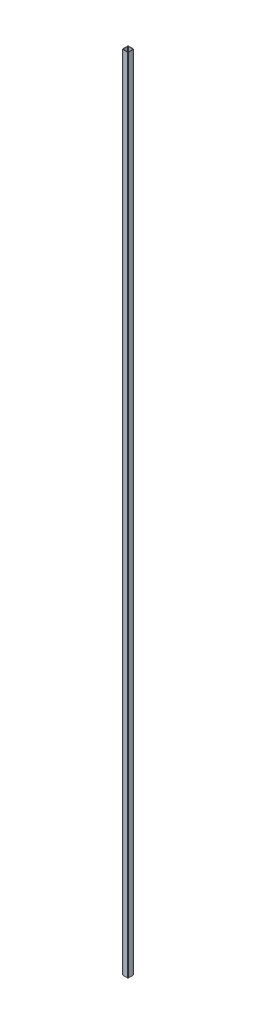
ISO-10303-21;
HEADER;
FILE_DESCRIPTION(('STEP AP214'),'2;1');
FILE_NAME('part.step','',(''),(''),'','','');
FILE_SCHEMA(('AUTOMOTIVE_DESIGN { 1 0 10303 214 1 1 1 1 }'));
ENDSEC;
DATA;
#1=APPLICATION_CONTEXT('core data for automotive mechanical design processes');
#2=APPLICATION_PROTOCOL_DEFINITION('international standard','automotive_design',2000,#1);
#3=PRODUCT_CONTEXT('',#1,'mechanical');
#4=PRODUCT('Part','Part','',(#3));
#5=PRODUCT_RELATED_PRODUCT_CATEGORY('part','',(#4));
#6=PRODUCT_DEFINITION_FORMATION('','',#4);
#7=PRODUCT_DEFINITION_CONTEXT('part definition',#1,'design');
#8=PRODUCT_DEFINITION('design','',#6,#7);
#9=PRODUCT_DEFINITION_SHAPE('','',#8);
#10=(LENGTH_UNIT() NAMED_UNIT(*) SI_UNIT(.MILLI.,.METRE.));
#11=(NAMED_UNIT(*) PLANE_ANGLE_UNIT() SI_UNIT($,.RADIAN.));
#12=(NAMED_UNIT(*) SI_UNIT($,.STERADIAN.) SOLID_ANGLE_UNIT());
#13=UNCERTAINTY_MEASURE_WITH_UNIT(LENGTH_MEASURE(1.E-05),#10,'distance_accuracy_value','');
#14=(GEOMETRIC_REPRESENTATION_CONTEXT(3) GLOBAL_UNCERTAINTY_ASSIGNED_CONTEXT((#13)) GLOBAL_UNIT_ASSIGNED_CONTEXT((#10,
#11,#12)) REPRESENTATION_CONTEXT('',''));
#15=CARTESIAN_POINT('',(0.,0.,0.));
#16=DIRECTION('',(0.,0.,1.));
#17=DIRECTION('',(1.,0.,0.));
#18=AXIS2_PLACEMENT_3D('',#15,#16,#17);
#19=CARTESIAN_POINT('',(-3.,1100.,-3.));
#20=DIRECTION('',(0.,-1.,0.));
#21=DIRECTION('',(0.,0.,1.));
#22=AXIS2_PLACEMENT_3D('',#19,#20,#21);
#23=PLANE('',#22);
#24=CARTESIAN_POINT('',(-3.,1100.,-3.));
#25=DIRECTION('',(0.,-1.,0.));
#26=DIRECTION('',(0.,0.,1.));
#27=AXIS2_PLACEMENT_3D('',#24,#25,#26);
#28=CIRCLE('',#27,1.);
#29=CARTESIAN_POINT('',(-4.,1100.,-3.));
#30=VERTEX_POINT('',#29);
#31=CARTESIAN_POINT('',(-3.,1100.,-4.));
#32=VERTEX_POINT('',#31);
#33=EDGE_CURVE('E215',#30,#32,#28,.T.);
#34=ORIENTED_EDGE('',*,*,#33,.F.);
#35=DIRECTION('',(0.,0.,-1.));
#36=VECTOR('',#35,1.);
#37=CARTESIAN_POINT('',(-4.,1100.,-3.));
#38=LINE('',#37,#36);
#39=CARTESIAN_POINT('',(-4.,1100.,3.));
#40=VERTEX_POINT('',#39);
#41=EDGE_CURVE('E237',#40,#30,#38,.T.);
#42=ORIENTED_EDGE('',*,*,#41,.F.);
#43=CARTESIAN_POINT('',(-3.,1100.,3.));
#44=DIRECTION('',(0.,-1.,0.));
#45=DIRECTION('',(0.,0.,1.));
#46=AXIS2_PLACEMENT_3D('',#43,#44,#45);
#47=CIRCLE('',#46,1.);
#48=CARTESIAN_POINT('',(-3.,1100.,4.));
#49=VERTEX_POINT('',#48);
#50=EDGE_CURVE('E234',#49,#40,#47,.T.);
#51=ORIENTED_EDGE('',*,*,#50,.F.);
#52=DIRECTION('',(-1.,0.,0.));
#53=VECTOR('',#52,1.);
#54=CARTESIAN_POINT('',(-3.,1100.,4.));
#55=LINE('',#54,#53);
#56=CARTESIAN_POINT('',(3.,1100.,4.));
#57=VERTEX_POINT('',#56);
#58=EDGE_CURVE('E231',#57,#49,#55,.T.);
#59=ORIENTED_EDGE('',*,*,#58,.F.);
#60=CARTESIAN_POINT('',(3.,1100.,3.));
#61=DIRECTION('',(0.,-1.,0.));
#62=DIRECTION('',(0.,0.,1.));
#63=AXIS2_PLACEMENT_3D('',#60,#61,#62);
#64=CIRCLE('',#63,1.);
#65=CARTESIAN_POINT('',(4.,1100.,3.));
#66=VERTEX_POINT('',#65);
#67=EDGE_CURVE('E228',#66,#57,#64,.T.);
#68=ORIENTED_EDGE('',*,*,#67,.F.);
#69=DIRECTION('',(0.,0.,1.));
#70=VECTOR('',#69,1.);
#71=CARTESIAN_POINT('',(4.,1100.,-3.));
#72=LINE('',#71,#70);
#73=CARTESIAN_POINT('',(4.,1100.,-3.));
#74=VERTEX_POINT('',#73);
#75=EDGE_CURVE('E225',#74,#66,#72,.T.);
#76=ORIENTED_EDGE('',*,*,#75,.F.);
#77=CARTESIAN_POINT('',(3.,1100.,-3.));
#78=DIRECTION('',(0.,-1.,0.));
#79=DIRECTION('',(0.,0.,-1.));
#80=AXIS2_PLACEMENT_3D('',#77,#78,#79);
#81=CIRCLE('',#80,1.);
#82=CARTESIAN_POINT('',(3.,1100.,-4.));
#83=VERTEX_POINT('',#82);
#84=EDGE_CURVE('E222',#83,#74,#81,.T.);
#85=ORIENTED_EDGE('',*,*,#84,.F.);
#86=DIRECTION('',(1.,0.,0.));
#87=VECTOR('',#86,1.);
#88=CARTESIAN_POINT('',(-3.,1100.,-4.));
#89=LINE('',#88,#87);
#90=EDGE_CURVE('E218',#32,#83,#89,.T.);
#91=ORIENTED_EDGE('',*,*,#90,.F.);
#92=EDGE_LOOP('',(#34,#42,#51,#59,#68,#76,#85,#91));
#93=FACE_BOUND('',#92,.T.);
#94=CARTESIAN_POINT('',(-2.5,1100.,-2.5));
#95=DIRECTION('',(0.,-1.,0.));
#96=DIRECTION('',(0.,0.,1.));
#97=AXIS2_PLACEMENT_3D('',#94,#95,#96);
#98=CIRCLE('',#97,1.);
#99=CARTESIAN_POINT('',(-3.5,1100.,-2.5));
#100=VERTEX_POINT('',#99);
#101=CARTESIAN_POINT('',(-2.5,1100.,-3.5));
#102=VERTEX_POINT('',#101);
#103=EDGE_CURVE('E150',#100,#102,#98,.T.);
#104=ORIENTED_EDGE('',*,*,#103,.T.);
#105=DIRECTION('',(1.,0.,0.));
#106=VECTOR('',#105,1.);
#107=CARTESIAN_POINT('',(-2.5,1100.,-3.5));
#108=LINE('',#107,#106);
#109=CARTESIAN_POINT('',(2.5,1100.,-3.5));
#110=VERTEX_POINT('',#109);
#111=EDGE_CURVE('E159',#102,#110,#108,.T.);
#112=ORIENTED_EDGE('',*,*,#111,.T.);
#113=CARTESIAN_POINT('',(2.5,1100.,-2.5));
#114=DIRECTION('',(0.,-1.,0.));
#115=DIRECTION('',(0.,0.,-1.));
#116=AXIS2_PLACEMENT_3D('',#113,#114,#115);
#117=CIRCLE('',#116,1.);
#118=CARTESIAN_POINT('',(3.5,1100.,-2.5));
#119=VERTEX_POINT('',#118);
#120=EDGE_CURVE('E164',#110,#119,#117,.T.);
#121=ORIENTED_EDGE('',*,*,#120,.T.);
#122=DIRECTION('',(0.,0.,1.));
#123=VECTOR('',#122,1.);
#124=CARTESIAN_POINT('',(3.5,1100.,-2.5));
#125=LINE('',#124,#123);
#126=CARTESIAN_POINT('',(3.5,1100.,2.5));
#127=VERTEX_POINT('',#126);
#128=EDGE_CURVE('E176',#119,#127,#125,.T.);
#129=ORIENTED_EDGE('',*,*,#128,.T.);
#130=CARTESIAN_POINT('',(2.5,1100.,2.5));
#131=DIRECTION('',(0.,-1.,0.));
#132=DIRECTION('',(0.,0.,1.));
#133=AXIS2_PLACEMENT_3D('',#130,#131,#132);
#134=CIRCLE('',#133,1.);
#135=CARTESIAN_POINT('',(2.5,1100.,3.5));
#136=VERTEX_POINT('',#135);
#137=EDGE_CURVE('E179',#127,#136,#134,.T.);
#138=ORIENTED_EDGE('',*,*,#137,.T.);
#139=DIRECTION('',(-1.,0.,0.));
#140=VECTOR('',#139,1.);
#141=CARTESIAN_POINT('',(-2.5,1100.,3.5));
#142=LINE('',#141,#140);
#143=CARTESIAN_POINT('',(-2.5,1100.,3.5));
#144=VERTEX_POINT('',#143);
#145=EDGE_CURVE('E182',#136,#144,#142,.T.);
#146=ORIENTED_EDGE('',*,*,#145,.T.);
#147=CARTESIAN_POINT('',(-2.5,1100.,2.5));
#148=DIRECTION('',(0.,-1.,0.));
#149=DIRECTION('',(0.,0.,1.));
#150=AXIS2_PLACEMENT_3D('',#147,#148,#149);
#151=CIRCLE('',#150,1.);
#152=CARTESIAN_POINT('',(-3.5,1100.,2.5));
#153=VERTEX_POINT('',#152);
#154=EDGE_CURVE('E185',#144,#153,#151,.T.);
#155=ORIENTED_EDGE('',*,*,#154,.T.);
#156=DIRECTION('',(0.,0.,-1.));
#157=VECTOR('',#156,1.);
#158=CARTESIAN_POINT('',(-3.5,1100.,-2.5));
#159=LINE('',#158,#157);
#160=EDGE_CURVE('E168',#153,#100,#159,.T.);
#161=ORIENTED_EDGE('',*,*,#160,.T.);
#162=EDGE_LOOP('',(#104,#112,#121,#129,#138,#146,#155,#161));
#163=FACE_BOUND('',#162,.T.);
#164=ADVANCED_FACE('F35',(#93,#163),#23,.F.);
#165=CARTESIAN_POINT('',(-3.,0.,-3.));
#166=DIRECTION('',(0.,-1.,0.));
#167=DIRECTION('',(0.,0.,1.));
#168=AXIS2_PLACEMENT_3D('',#165,#166,#167);
#169=PLANE('',#168);
#170=CARTESIAN_POINT('',(-3.,0.,-3.));
#171=DIRECTION('',(0.,-1.,0.));
#172=DIRECTION('',(0.,0.,1.));
#173=AXIS2_PLACEMENT_3D('',#170,#171,#172);
#174=CIRCLE('',#173,1.);
#175=CARTESIAN_POINT('',(-4.,0.,-3.));
#176=VERTEX_POINT('',#175);
#177=CARTESIAN_POINT('',(-3.,0.,-4.));
#178=VERTEX_POINT('',#177);
#179=EDGE_CURVE('E155',#176,#178,#174,.T.);
#180=ORIENTED_EDGE('',*,*,#179,.T.);
#181=DIRECTION('',(1.,0.,0.));
#182=VECTOR('',#181,1.);
#183=CARTESIAN_POINT('',(-3.,0.,-4.));
#184=LINE('',#183,#182);
#185=CARTESIAN_POINT('',(3.,0.,-4.));
#186=VERTEX_POINT('',#185);
#187=EDGE_CURVE('E243',#178,#186,#184,.T.);
#188=ORIENTED_EDGE('',*,*,#187,.T.);
#189=CARTESIAN_POINT('',(3.,0.,-3.));
#190=DIRECTION('',(0.,-1.,0.));
#191=DIRECTION('',(0.,0.,-1.));
#192=AXIS2_PLACEMENT_3D('',#189,#190,#191);
#193=CIRCLE('',#192,1.);
#194=CARTESIAN_POINT('',(4.,0.,-3.));
#195=VERTEX_POINT('',#194);
#196=EDGE_CURVE('E246',#186,#195,#193,.T.);
#197=ORIENTED_EDGE('',*,*,#196,.T.);
#198=DIRECTION('',(0.,0.,1.));
#199=VECTOR('',#198,1.);
#200=CARTESIAN_POINT('',(4.,0.,-3.));
#201=LINE('',#200,#199);
#202=CARTESIAN_POINT('',(4.,0.,3.));
#203=VERTEX_POINT('',#202);
#204=EDGE_CURVE('E249',#195,#203,#201,.T.);
#205=ORIENTED_EDGE('',*,*,#204,.T.);
#206=CARTESIAN_POINT('',(3.,0.,3.));
#207=DIRECTION('',(0.,-1.,0.));
#208=DIRECTION('',(0.,0.,1.));
#209=AXIS2_PLACEMENT_3D('',#206,#207,#208);
#210=CIRCLE('',#209,1.);
#211=CARTESIAN_POINT('',(3.,0.,4.));
#212=VERTEX_POINT('',#211);
#213=EDGE_CURVE('E252',#203,#212,#210,.T.);
#214=ORIENTED_EDGE('',*,*,#213,.T.);
#215=DIRECTION('',(-1.,0.,0.));
#216=VECTOR('',#215,1.);
#217=CARTESIAN_POINT('',(-3.,0.,4.));
#218=LINE('',#217,#216);
#219=CARTESIAN_POINT('',(-3.,0.,4.));
#220=VERTEX_POINT('',#219);
#221=EDGE_CURVE('E255',#212,#220,#218,.T.);
#222=ORIENTED_EDGE('',*,*,#221,.T.);
#223=CARTESIAN_POINT('',(-3.,0.,3.));
#224=DIRECTION('',(0.,-1.,0.));
#225=DIRECTION('',(0.,0.,1.));
#226=AXIS2_PLACEMENT_3D('',#223,#224,#225);
#227=CIRCLE('',#226,1.);
#228=CARTESIAN_POINT('',(-4.,0.,3.));
#229=VERTEX_POINT('',#228);
#230=EDGE_CURVE('E258',#220,#229,#227,.T.);
#231=ORIENTED_EDGE('',*,*,#230,.T.);
#232=DIRECTION('',(0.,0.,-1.));
#233=VECTOR('',#232,1.);
#234=CARTESIAN_POINT('',(-4.,0.,-3.));
#235=LINE('',#234,#233);
#236=EDGE_CURVE('E219',#229,#176,#235,.T.);
#237=ORIENTED_EDGE('',*,*,#236,.T.);
#238=EDGE_LOOP('',(#180,#188,#197,#205,#214,#222,#231,#237));
#239=FACE_BOUND('',#238,.T.);
#240=DIRECTION('',(0.,0.,-1.));
#241=VECTOR('',#240,1.);
#242=CARTESIAN_POINT('',(-3.5,0.,-2.5));
#243=LINE('',#242,#241);
#244=CARTESIAN_POINT('',(-3.5,0.,2.5));
#245=VERTEX_POINT('',#244);
#246=CARTESIAN_POINT('',(-3.5,0.,-2.5));
#247=VERTEX_POINT('',#246);
#248=EDGE_CURVE('E169',#245,#247,#243,.T.);
#249=ORIENTED_EDGE('',*,*,#248,.F.);
#250=CARTESIAN_POINT('',(-2.5,0.,2.5));
#251=DIRECTION('',(0.,-1.,0.));
#252=DIRECTION('',(0.,0.,1.));
#253=AXIS2_PLACEMENT_3D('',#250,#251,#252);
#254=CIRCLE('',#253,1.);
#255=CARTESIAN_POINT('',(-2.5,0.,3.5));
#256=VERTEX_POINT('',#255);
#257=EDGE_CURVE('E172',#256,#245,#254,.T.);
#258=ORIENTED_EDGE('',*,*,#257,.F.);
#259=DIRECTION('',(-1.,0.,0.));
#260=VECTOR('',#259,1.);
#261=CARTESIAN_POINT('',(-2.5,0.,3.5));
#262=LINE('',#261,#260);
#263=CARTESIAN_POINT('',(2.5,0.,3.5));
#264=VERTEX_POINT('',#263);
#265=EDGE_CURVE('E200',#264,#256,#262,.T.);
#266=ORIENTED_EDGE('',*,*,#265,.F.);
#267=CARTESIAN_POINT('',(2.5,0.,2.5));
#268=DIRECTION('',(0.,-1.,0.));
#269=DIRECTION('',(0.,0.,1.));
#270=AXIS2_PLACEMENT_3D('',#267,#268,#269);
#271=CIRCLE('',#270,1.);
#272=CARTESIAN_POINT('',(3.5,0.,2.5));
#273=VERTEX_POINT('',#272);
#274=EDGE_CURVE('E197',#273,#264,#271,.T.);
#275=ORIENTED_EDGE('',*,*,#274,.F.);
#276=DIRECTION('',(0.,0.,1.));
#277=VECTOR('',#276,1.);
#278=CARTESIAN_POINT('',(3.5,0.,-2.5));
#279=LINE('',#278,#277);
#280=CARTESIAN_POINT('',(3.5,0.,-2.5));
#281=VERTEX_POINT('',#280);
#282=EDGE_CURVE('E194',#281,#273,#279,.T.);
#283=ORIENTED_EDGE('',*,*,#282,.F.);
#284=CARTESIAN_POINT('',(2.5,0.,-2.5));
#285=DIRECTION('',(0.,-1.,0.));
#286=DIRECTION('',(0.,0.,-1.));
#287=AXIS2_PLACEMENT_3D('',#284,#285,#286);
#288=CIRCLE('',#287,1.);
#289=CARTESIAN_POINT('',(2.5,0.,-3.5));
#290=VERTEX_POINT('',#289);
#291=EDGE_CURVE('E191',#290,#281,#288,.T.);
#292=ORIENTED_EDGE('',*,*,#291,.F.);
#293=DIRECTION('',(1.,0.,0.));
#294=VECTOR('',#293,1.);
#295=CARTESIAN_POINT('',(-2.5,0.,-3.5));
#296=LINE('',#295,#294);
#297=CARTESIAN_POINT('',(-2.5,0.,-3.5));
#298=VERTEX_POINT('',#297);
#299=EDGE_CURVE('E189',#298,#290,#296,.T.);
#300=ORIENTED_EDGE('',*,*,#299,.F.);
#301=CARTESIAN_POINT('',(-2.5,0.,-2.5));
#302=DIRECTION('',(0.,-1.,0.));
#303=DIRECTION('',(0.,0.,1.));
#304=AXIS2_PLACEMENT_3D('',#301,#302,#303);
#305=CIRCLE('',#304,1.);
#306=EDGE_CURVE('E151',#247,#298,#305,.T.);
#307=ORIENTED_EDGE('',*,*,#306,.F.);
#308=EDGE_LOOP('',(#249,#258,#266,#275,#283,#292,#300,#307));
#309=FACE_BOUND('',#308,.T.);
#310=ADVANCED_FACE('F283',(#239,#309),#169,.T.);
#311=CARTESIAN_POINT('',(-3.,1100.,-3.));
#312=DIRECTION('',(0.,-1.,0.));
#313=DIRECTION('',(0.,0.,1.));
#314=AXIS2_PLACEMENT_3D('',#311,#312,#313);
#315=CYLINDRICAL_SURFACE('',#314,1.);
#316=ORIENTED_EDGE('',*,*,#179,.F.);
#317=DIRECTION('',(0.,-1.,0.));
#318=VECTOR('',#317,1.);
#319=CARTESIAN_POINT('',(-4.,1100.,-3.));
#320=LINE('',#319,#318);
#321=EDGE_CURVE('E240',#30,#176,#320,.T.);
#322=ORIENTED_EDGE('',*,*,#321,.F.);
#323=ORIENTED_EDGE('',*,*,#33,.T.);
#324=DIRECTION('',(0.,-1.,0.));
#325=VECTOR('',#324,1.);
#326=CARTESIAN_POINT('',(-3.,1100.,-4.));
#327=LINE('',#326,#325);
#328=EDGE_CURVE('E11',#32,#178,#327,.T.);
#329=ORIENTED_EDGE('',*,*,#328,.T.);
#330=EDGE_LOOP('',(#316,#322,#323,#329));
#331=FACE_BOUND('',#330,.T.);
#332=ADVANCED_FACE('F37',(#331),#315,.T.);
#333=CARTESIAN_POINT('',(-3.,1100.,-4.));
#334=DIRECTION('',(0.,0.,1.));
#335=DIRECTION('',(-1.,0.,0.));
#336=AXIS2_PLACEMENT_3D('',#333,#334,#335);
#337=PLANE('',#336);
#338=ORIENTED_EDGE('',*,*,#187,.F.);
#339=ORIENTED_EDGE('',*,*,#328,.F.);
#340=ORIENTED_EDGE('',*,*,#90,.T.);
#341=DIRECTION('',(0.,-1.,0.));
#342=VECTOR('',#341,1.);
#343=CARTESIAN_POINT('',(3.,1100.,-4.));
#344=LINE('',#343,#342);
#345=EDGE_CURVE('E43',#83,#186,#344,.T.);
#346=ORIENTED_EDGE('',*,*,#345,.T.);
#347=EDGE_LOOP('',(#338,#339,#340,#346));
#348=FACE_BOUND('',#347,.T.);
#349=ADVANCED_FACE('F276',(#348),#337,.F.);
#350=CARTESIAN_POINT('',(3.,1100.,-3.));
#351=DIRECTION('',(0.,-1.,0.));
#352=DIRECTION('',(0.,0.,1.));
#353=AXIS2_PLACEMENT_3D('',#350,#351,#352);
#354=CYLINDRICAL_SURFACE('',#353,1.);
#355=ORIENTED_EDGE('',*,*,#196,.F.);
#356=ORIENTED_EDGE('',*,*,#345,.F.);
#357=ORIENTED_EDGE('',*,*,#84,.T.);
#358=DIRECTION('',(0.,-1.,0.));
#359=VECTOR('',#358,1.);
#360=CARTESIAN_POINT('',(4.,1100.,-3.));
#361=LINE('',#360,#359);
#362=EDGE_CURVE('E272',#74,#195,#361,.T.);
#363=ORIENTED_EDGE('',*,*,#362,.T.);
#364=EDGE_LOOP('',(#355,#356,#357,#363));
#365=FACE_BOUND('',#364,.T.);
#366=ADVANCED_FACE('F280',(#365),#354,.T.);
#367=CARTESIAN_POINT('',(4.,1100.,-3.));
#368=DIRECTION('',(-1.,0.,0.));
#369=DIRECTION('',(0.,0.,-1.));
#370=AXIS2_PLACEMENT_3D('',#367,#368,#369);
#371=PLANE('',#370);
#372=ORIENTED_EDGE('',*,*,#204,.F.);
#373=ORIENTED_EDGE('',*,*,#362,.F.);
#374=ORIENTED_EDGE('',*,*,#75,.T.);
#375=DIRECTION('',(0.,-1.,0.));
#376=VECTOR('',#375,1.);
#377=CARTESIAN_POINT('',(4.,1100.,3.));
#378=LINE('',#377,#376);
#379=EDGE_CURVE('E270',#66,#203,#378,.T.);
#380=ORIENTED_EDGE('',*,*,#379,.T.);
#381=EDGE_LOOP('',(#372,#373,#374,#380));
#382=FACE_BOUND('',#381,.T.);
#383=ADVANCED_FACE('F295',(#382),#371,.F.);
#384=CARTESIAN_POINT('',(3.,1100.,3.));
#385=DIRECTION('',(0.,-1.,0.));
#386=DIRECTION('',(0.,0.,1.));
#387=AXIS2_PLACEMENT_3D('',#384,#385,#386);
#388=CYLINDRICAL_SURFACE('',#387,1.);
#389=ORIENTED_EDGE('',*,*,#213,.F.);
#390=ORIENTED_EDGE('',*,*,#379,.F.);
#391=ORIENTED_EDGE('',*,*,#67,.T.);
#392=DIRECTION('',(0.,-1.,0.));
#393=VECTOR('',#392,1.);
#394=CARTESIAN_POINT('',(3.,1100.,4.));
#395=LINE('',#394,#393);
#396=EDGE_CURVE('E268',#57,#212,#395,.T.);
#397=ORIENTED_EDGE('',*,*,#396,.T.);
#398=EDGE_LOOP('',(#389,#390,#391,#397));
#399=FACE_BOUND('',#398,.T.);
#400=ADVANCED_FACE('F299',(#399),#388,.T.);
#401=CARTESIAN_POINT('',(-3.,1100.,4.));
#402=DIRECTION('',(0.,0.,-1.));
#403=DIRECTION('',(1.,0.,0.));
#404=AXIS2_PLACEMENT_3D('',#401,#402,#403);
#405=PLANE('',#404);
#406=ORIENTED_EDGE('',*,*,#221,.F.);
#407=ORIENTED_EDGE('',*,*,#396,.F.);
#408=ORIENTED_EDGE('',*,*,#58,.T.);
#409=DIRECTION('',(0.,-1.,0.));
#410=VECTOR('',#409,1.);
#411=CARTESIAN_POINT('',(-3.,1100.,4.));
#412=LINE('',#411,#410);
#413=EDGE_CURVE('E266',#49,#220,#412,.T.);
#414=ORIENTED_EDGE('',*,*,#413,.T.);
#415=EDGE_LOOP('',(#406,#407,#408,#414));
#416=FACE_BOUND('',#415,.T.);
#417=ADVANCED_FACE('F301',(#416),#405,.F.);
#418=CARTESIAN_POINT('',(-3.,1100.,3.));
#419=DIRECTION('',(0.,-1.,0.));
#420=DIRECTION('',(0.,0.,1.));
#421=AXIS2_PLACEMENT_3D('',#418,#419,#420);
#422=CYLINDRICAL_SURFACE('',#421,1.);
#423=ORIENTED_EDGE('',*,*,#230,.F.);
#424=ORIENTED_EDGE('',*,*,#413,.F.);
#425=ORIENTED_EDGE('',*,*,#50,.T.);
#426=DIRECTION('',(0.,-1.,0.));
#427=VECTOR('',#426,1.);
#428=CARTESIAN_POINT('',(-4.,1100.,3.));
#429=LINE('',#428,#427);
#430=EDGE_CURVE('E264',#40,#229,#429,.T.);
#431=ORIENTED_EDGE('',*,*,#430,.T.);
#432=EDGE_LOOP('',(#423,#424,#425,#431));
#433=FACE_BOUND('',#432,.T.);
#434=ADVANCED_FACE('F305',(#433),#422,.T.);
#435=CARTESIAN_POINT('',(-4.,1100.,-3.));
#436=DIRECTION('',(1.,0.,0.));
#437=DIRECTION('',(0.,0.,1.));
#438=AXIS2_PLACEMENT_3D('',#435,#436,#437);
#439=PLANE('',#438);
#440=ORIENTED_EDGE('',*,*,#236,.F.);
#441=ORIENTED_EDGE('',*,*,#430,.F.);
#442=ORIENTED_EDGE('',*,*,#41,.T.);
#443=ORIENTED_EDGE('',*,*,#321,.T.);
#444=EDGE_LOOP('',(#440,#441,#442,#443));
#445=FACE_BOUND('',#444,.T.);
#446=ADVANCED_FACE('F307',(#445),#439,.F.);
#447=CARTESIAN_POINT('',(-2.5,1100.,-2.5));
#448=DIRECTION('',(0.,-1.,0.));
#449=DIRECTION('',(0.,0.,1.));
#450=AXIS2_PLACEMENT_3D('',#447,#448,#449);
#451=CYLINDRICAL_SURFACE('',#450,1.);
#452=ORIENTED_EDGE('',*,*,#306,.T.);
#453=DIRECTION('',(0.,-1.,0.));
#454=VECTOR('',#453,1.);
#455=CARTESIAN_POINT('',(-2.5,1100.,-3.5));
#456=LINE('',#455,#454);
#457=EDGE_CURVE('E146',#102,#298,#456,.T.);
#458=ORIENTED_EDGE('',*,*,#457,.F.);
#459=ORIENTED_EDGE('',*,*,#103,.F.);
#460=DIRECTION('',(0.,-1.,0.));
#461=VECTOR('',#460,1.);
#462=CARTESIAN_POINT('',(-3.5,1100.,-2.5));
#463=LINE('',#462,#461);
#464=EDGE_CURVE('E58',#100,#247,#463,.T.);
#465=ORIENTED_EDGE('',*,*,#464,.T.);
#466=EDGE_LOOP('',(#452,#458,#459,#465));
#467=FACE_BOUND('',#466,.T.);
#468=ADVANCED_FACE('F148',(#467),#451,.F.);
#469=CARTESIAN_POINT('',(-2.5,1100.,-3.5));
#470=DIRECTION('',(0.,0.,1.));
#471=DIRECTION('',(-1.,0.,0.));
#472=AXIS2_PLACEMENT_3D('',#469,#470,#471);
#473=PLANE('',#472);
#474=ORIENTED_EDGE('',*,*,#299,.T.);
#475=DIRECTION('',(0.,-1.,0.));
#476=VECTOR('',#475,1.);
#477=CARTESIAN_POINT('',(2.5,1100.,-3.5));
#478=LINE('',#477,#476);
#479=EDGE_CURVE('E156',#110,#290,#478,.T.);
#480=ORIENTED_EDGE('',*,*,#479,.F.);
#481=ORIENTED_EDGE('',*,*,#111,.F.);
#482=ORIENTED_EDGE('',*,*,#457,.T.);
#483=EDGE_LOOP('',(#474,#480,#481,#482));
#484=FACE_BOUND('',#483,.T.);
#485=ADVANCED_FACE('F160',(#484),#473,.T.);
#486=CARTESIAN_POINT('',(2.5,1100.,-2.5));
#487=DIRECTION('',(0.,-1.,0.));
#488=DIRECTION('',(0.,0.,1.));
#489=AXIS2_PLACEMENT_3D('',#486,#487,#488);
#490=CYLINDRICAL_SURFACE('',#489,1.);
#491=ORIENTED_EDGE('',*,*,#291,.T.);
#492=DIRECTION('',(0.,-1.,0.));
#493=VECTOR('',#492,1.);
#494=CARTESIAN_POINT('',(3.5,1100.,-2.5));
#495=LINE('',#494,#493);
#496=EDGE_CURVE('E212',#119,#281,#495,.T.);
#497=ORIENTED_EDGE('',*,*,#496,.F.);
#498=ORIENTED_EDGE('',*,*,#120,.F.);
#499=ORIENTED_EDGE('',*,*,#479,.T.);
#500=EDGE_LOOP('',(#491,#497,#498,#499));
#501=FACE_BOUND('',#500,.T.);
#502=ADVANCED_FACE('F325',(#501),#490,.F.);
#503=CARTESIAN_POINT('',(3.5,1100.,-2.5));
#504=DIRECTION('',(-1.,0.,0.));
#505=DIRECTION('',(0.,0.,-1.));
#506=AXIS2_PLACEMENT_3D('',#503,#504,#505);
#507=PLANE('',#506);
#508=ORIENTED_EDGE('',*,*,#282,.T.);
#509=DIRECTION('',(0.,-1.,0.));
#510=VECTOR('',#509,1.);
#511=CARTESIAN_POINT('',(3.5,1100.,2.5));
#512=LINE('',#511,#510);
#513=EDGE_CURVE('E210',#127,#273,#512,.T.);
#514=ORIENTED_EDGE('',*,*,#513,.F.);
#515=ORIENTED_EDGE('',*,*,#128,.F.);
#516=ORIENTED_EDGE('',*,*,#496,.T.);
#517=EDGE_LOOP('',(#508,#514,#515,#516));
#518=FACE_BOUND('',#517,.T.);
#519=ADVANCED_FACE('F328',(#518),#507,.T.);
#520=CARTESIAN_POINT('',(2.5,1100.,2.5));
#521=DIRECTION('',(0.,-1.,0.));
#522=DIRECTION('',(0.,0.,1.));
#523=AXIS2_PLACEMENT_3D('',#520,#521,#522);
#524=CYLINDRICAL_SURFACE('',#523,1.);
#525=ORIENTED_EDGE('',*,*,#274,.T.);
#526=DIRECTION('',(0.,-1.,0.));
#527=VECTOR('',#526,1.);
#528=CARTESIAN_POINT('',(2.5,1100.,3.5));
#529=LINE('',#528,#527);
#530=EDGE_CURVE('E208',#136,#264,#529,.T.);
#531=ORIENTED_EDGE('',*,*,#530,.F.);
#532=ORIENTED_EDGE('',*,*,#137,.F.);
#533=ORIENTED_EDGE('',*,*,#513,.T.);
#534=EDGE_LOOP('',(#525,#531,#532,#533));
#535=FACE_BOUND('',#534,.T.);
#536=ADVANCED_FACE('F332',(#535),#524,.F.);
#537=CARTESIAN_POINT('',(-2.5,1100.,3.5));
#538=DIRECTION('',(0.,0.,-1.));
#539=DIRECTION('',(1.,0.,0.));
#540=AXIS2_PLACEMENT_3D('',#537,#538,#539);
#541=PLANE('',#540);
#542=ORIENTED_EDGE('',*,*,#265,.T.);
#543=DIRECTION('',(0.,-1.,0.));
#544=VECTOR('',#543,1.);
#545=CARTESIAN_POINT('',(-2.5,1100.,3.5));
#546=LINE('',#545,#544);
#547=EDGE_CURVE('E206',#144,#256,#546,.T.);
#548=ORIENTED_EDGE('',*,*,#547,.F.);
#549=ORIENTED_EDGE('',*,*,#145,.F.);
#550=ORIENTED_EDGE('',*,*,#530,.T.);
#551=EDGE_LOOP('',(#542,#548,#549,#550));
#552=FACE_BOUND('',#551,.T.);
#553=ADVANCED_FACE('F336',(#552),#541,.T.);
#554=CARTESIAN_POINT('',(-2.5,1100.,2.5));
#555=DIRECTION('',(0.,-1.,0.));
#556=DIRECTION('',(0.,0.,1.));
#557=AXIS2_PLACEMENT_3D('',#554,#555,#556);
#558=CYLINDRICAL_SURFACE('',#557,1.);
#559=ORIENTED_EDGE('',*,*,#257,.T.);
#560=DIRECTION('',(0.,-1.,0.));
#561=VECTOR('',#560,1.);
#562=CARTESIAN_POINT('',(-3.5,1100.,2.5));
#563=LINE('',#562,#561);
#564=EDGE_CURVE('E50',#153,#245,#563,.T.);
#565=ORIENTED_EDGE('',*,*,#564,.F.);
#566=ORIENTED_EDGE('',*,*,#154,.F.);
#567=ORIENTED_EDGE('',*,*,#547,.T.);
#568=EDGE_LOOP('',(#559,#565,#566,#567));
#569=FACE_BOUND('',#568,.T.);
#570=ADVANCED_FACE('F340',(#569),#558,.F.);
#571=CARTESIAN_POINT('',(-3.5,1100.,-2.5));
#572=DIRECTION('',(1.,0.,0.));
#573=DIRECTION('',(0.,0.,1.));
#574=AXIS2_PLACEMENT_3D('',#571,#572,#573);
#575=PLANE('',#574);
#576=ORIENTED_EDGE('',*,*,#248,.T.);
#577=ORIENTED_EDGE('',*,*,#464,.F.);
#578=ORIENTED_EDGE('',*,*,#160,.F.);
#579=ORIENTED_EDGE('',*,*,#564,.T.);
#580=EDGE_LOOP('',(#576,#577,#578,#579));
#581=FACE_BOUND('',#580,.T.);
#582=ADVANCED_FACE('F344',(#581),#575,.T.);
#583=CLOSED_SHELL('',(#164,#310,#332,#349,#366,#383,#400,#417,#434,#446,#468,#485,#502,#519,
#536,#553,#570,#582));
#584=MANIFOLD_SOLID_BREP('B2',#583);
#585=ADVANCED_BREP_SHAPE_REPRESENTATION('',(#18,#584),#14);
#586=SHAPE_DEFINITION_REPRESENTATION(#9,#585);
ENDSEC;
END-ISO-10303-21;
